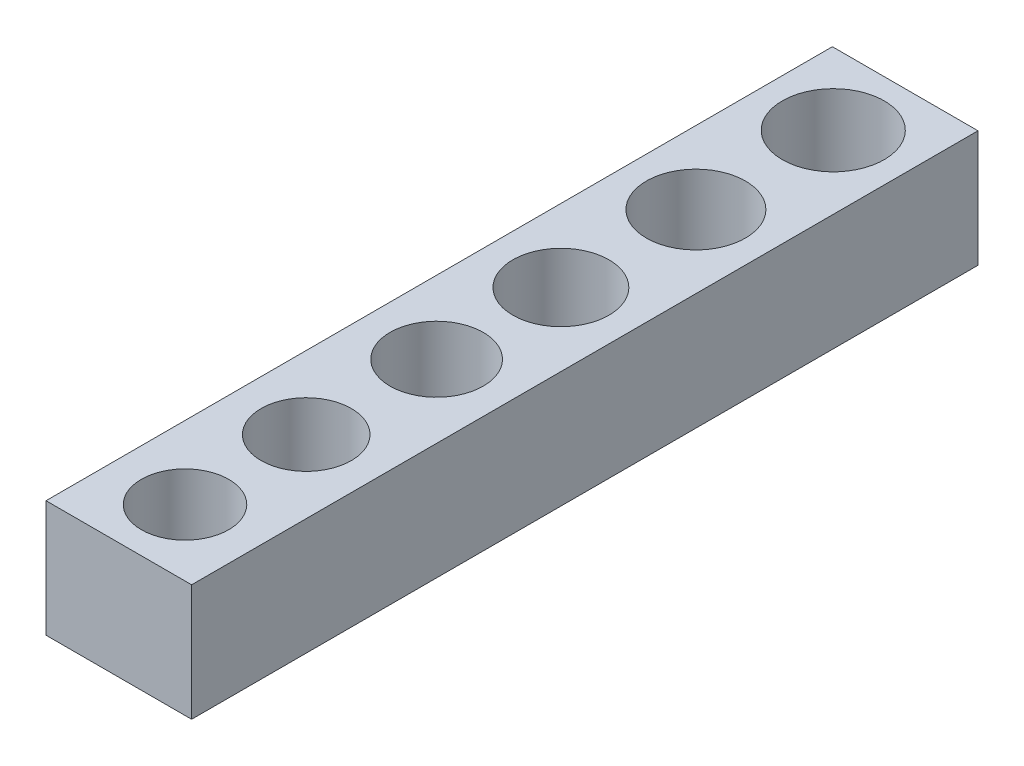
ISO-10303-21;
HEADER;
FILE_DESCRIPTION(('STEP AP214'),'2;1');
FILE_NAME('part.step','',(''),(''),'','','');
FILE_SCHEMA(('AUTOMOTIVE_DESIGN { 1 0 10303 214 1 1 1 1 }'));
ENDSEC;
DATA;
#1=APPLICATION_CONTEXT('core data for automotive mechanical design processes');
#2=APPLICATION_PROTOCOL_DEFINITION('international standard','automotive_design',2000,#1);
#3=PRODUCT_CONTEXT('',#1,'mechanical');
#4=PRODUCT('Part','Part','',(#3));
#5=PRODUCT_RELATED_PRODUCT_CATEGORY('part','',(#4));
#6=PRODUCT_DEFINITION_FORMATION('','',#4);
#7=PRODUCT_DEFINITION_CONTEXT('part definition',#1,'design');
#8=PRODUCT_DEFINITION('design','',#6,#7);
#9=PRODUCT_DEFINITION_SHAPE('','',#8);
#10=(LENGTH_UNIT() NAMED_UNIT(*) SI_UNIT(.MILLI.,.METRE.));
#11=(NAMED_UNIT(*) PLANE_ANGLE_UNIT() SI_UNIT($,.RADIAN.));
#12=(NAMED_UNIT(*) SI_UNIT($,.STERADIAN.) SOLID_ANGLE_UNIT());
#13=UNCERTAINTY_MEASURE_WITH_UNIT(LENGTH_MEASURE(1.E-05),#10,'distance_accuracy_value','');
#14=(GEOMETRIC_REPRESENTATION_CONTEXT(3) GLOBAL_UNCERTAINTY_ASSIGNED_CONTEXT((#13)) GLOBAL_UNIT_ASSIGNED_CONTEXT((#10,
#11,#12)) REPRESENTATION_CONTEXT('',''));
#15=CARTESIAN_POINT('',(0.,0.,0.));
#16=DIRECTION('',(0.,0.,1.));
#17=DIRECTION('',(1.,0.,0.));
#18=AXIS2_PLACEMENT_3D('',#15,#16,#17);
#19=CARTESIAN_POINT('',(0.,8.,0.));
#20=DIRECTION('',(0.,1.,0.));
#21=DIRECTION('',(0.,0.,1.));
#22=AXIS2_PLACEMENT_3D('',#19,#20,#21);
#23=PLANE('',#22);
#24=CARTESIAN_POINT('',(0.,8.,-20.0613158785714));
#25=DIRECTION('',(0.,1.,0.));
#26=DIRECTION('',(0.,0.,1.));
#27=AXIS2_PLACEMENT_3D('',#24,#25,#26);
#28=CIRCLE('',#27,3.5);
#29=CARTESIAN_POINT('',(0.,8.,-16.5613158785714));
#30=VERTEX_POINT('',#29);
#31=EDGE_CURVE('E164',#30,#30,#28,.T.);
#32=ORIENTED_EDGE('',*,*,#31,.F.);
#33=EDGE_LOOP('',(#32));
#34=FACE_BOUND('',#33,.T.);
#35=CARTESIAN_POINT('',(0.,8.,-10.6303891055312));
#36=DIRECTION('',(0.,1.,0.));
#37=DIRECTION('',(0.,0.,1.));
#38=AXIS2_PLACEMENT_3D('',#35,#36,#37);
#39=CIRCLE('',#38,3.4);
#40=CARTESIAN_POINT('',(0.,8.,-7.23038910553121));
#41=VERTEX_POINT('',#40);
#42=EDGE_CURVE('E148',#41,#41,#39,.T.);
#43=ORIENTED_EDGE('',*,*,#42,.F.);
#44=EDGE_LOOP('',(#43));
#45=FACE_BOUND('',#44,.T.);
#46=CARTESIAN_POINT('',(0.,8.,16.1307415705942));
#47=DIRECTION('',(0.,1.,0.));
#48=DIRECTION('',(0.,0.,1.));
#49=AXIS2_PLACEMENT_3D('',#46,#47,#48);
#50=CIRCLE('',#49,3.1);
#51=CARTESIAN_POINT('',(0.,8.,19.2307415705942));
#52=VERTEX_POINT('',#51);
#53=EDGE_CURVE('E118',#52,#52,#50,.T.);
#54=ORIENTED_EDGE('',*,*,#53,.F.);
#55=EDGE_LOOP('',(#54));
#56=FACE_BOUND('',#55,.T.);
#57=DIRECTION('',(0.,0.,1.));
#58=VECTOR('',#57,1.);
#59=CARTESIAN_POINT('',(-5.,8.,29.));
#60=LINE('',#59,#58);
#61=CARTESIAN_POINT('',(-5.,8.,-25.));
#62=VERTEX_POINT('',#61);
#63=CARTESIAN_POINT('',(-5.,8.,29.));
#64=VERTEX_POINT('',#63);
#65=EDGE_CURVE('E98',#62,#64,#60,.T.);
#66=ORIENTED_EDGE('',*,*,#65,.T.);
#67=DIRECTION('',(1.,0.,0.));
#68=VECTOR('',#67,1.);
#69=CARTESIAN_POINT('',(5.,8.,29.));
#70=LINE('',#69,#68);
#71=CARTESIAN_POINT('',(5.,8.,29.));
#72=VERTEX_POINT('',#71);
#73=EDGE_CURVE('E93',#64,#72,#70,.T.);
#74=ORIENTED_EDGE('',*,*,#73,.T.);
#75=DIRECTION('',(0.,0.,-1.));
#76=VECTOR('',#75,1.);
#77=CARTESIAN_POINT('',(5.,8.,29.));
#78=LINE('',#77,#76);
#79=CARTESIAN_POINT('',(5.,8.,-25.));
#80=VERTEX_POINT('',#79);
#81=EDGE_CURVE('E96',#72,#80,#78,.T.);
#82=ORIENTED_EDGE('',*,*,#81,.T.);
#83=DIRECTION('',(-1.,0.,0.));
#84=VECTOR('',#83,1.);
#85=CARTESIAN_POINT('',(5.,8.,-25.));
#86=LINE('',#85,#84);
#87=EDGE_CURVE('E63',#80,#62,#86,.T.);
#88=ORIENTED_EDGE('',*,*,#87,.T.);
#89=EDGE_LOOP('',(#66,#74,#82,#88));
#90=FACE_BOUND('',#89,.T.);
#91=CARTESIAN_POINT('',(0.,8.,-1.35881627285784));
#92=DIRECTION('',(0.,1.,0.));
#93=DIRECTION('',(0.,0.,1.));
#94=AXIS2_PLACEMENT_3D('',#91,#92,#93);
#95=CIRCLE('',#94,3.3);
#96=CARTESIAN_POINT('',(0.,8.,1.94118372714216));
#97=VERTEX_POINT('',#96);
#98=EDGE_CURVE('E140',#97,#97,#95,.T.);
#99=ORIENTED_EDGE('',*,*,#98,.F.);
#100=EDGE_LOOP('',(#99));
#101=FACE_BOUND('',#100,.T.);
#102=CARTESIAN_POINT('',(0.,8.,24.4540853635623));
#103=DIRECTION('',(0.,1.,0.));
#104=DIRECTION('',(0.,0.,1.));
#105=AXIS2_PLACEMENT_3D('',#102,#103,#104);
#106=CIRCLE('',#105,3.);
#107=CARTESIAN_POINT('',(0.,8.,27.4540853635623));
#108=VERTEX_POINT('',#107);
#109=EDGE_CURVE('E156',#108,#108,#106,.T.);
#110=ORIENTED_EDGE('',*,*,#109,.F.);
#111=EDGE_LOOP('',(#110));
#112=FACE_BOUND('',#111,.T.);
#113=CARTESIAN_POINT('',(0.,8.,7.17524508448924));
#114=DIRECTION('',(0.,1.,0.));
#115=DIRECTION('',(0.,0.,1.));
#116=AXIS2_PLACEMENT_3D('',#113,#114,#115);
#117=CIRCLE('',#116,3.2);
#118=CARTESIAN_POINT('',(0.,8.,10.3752450844892));
#119=VERTEX_POINT('',#118);
#120=EDGE_CURVE('E172',#119,#119,#117,.T.);
#121=ORIENTED_EDGE('',*,*,#120,.F.);
#122=EDGE_LOOP('',(#121));
#123=FACE_BOUND('',#122,.T.);
#124=ADVANCED_FACE('F45',(#34,#45,#56,#90,#101,#112,#123),#23,.T.);
#125=CARTESIAN_POINT('',(0.,0.,0.));
#126=DIRECTION('',(0.,1.,0.));
#127=DIRECTION('',(0.,0.,1.));
#128=AXIS2_PLACEMENT_3D('',#125,#126,#127);
#129=PLANE('',#128);
#130=DIRECTION('',(0.,0.,1.));
#131=VECTOR('',#130,1.);
#132=CARTESIAN_POINT('',(-5.,0.,29.));
#133=LINE('',#132,#131);
#134=CARTESIAN_POINT('',(-5.,0.,-25.));
#135=VERTEX_POINT('',#134);
#136=CARTESIAN_POINT('',(-5.,0.,29.));
#137=VERTEX_POINT('',#136);
#138=EDGE_CURVE('E114',#135,#137,#133,.T.);
#139=ORIENTED_EDGE('',*,*,#138,.F.);
#140=DIRECTION('',(-1.,0.,0.));
#141=VECTOR('',#140,1.);
#142=CARTESIAN_POINT('',(5.,0.,-25.));
#143=LINE('',#142,#141);
#144=CARTESIAN_POINT('',(5.,0.,-25.));
#145=VERTEX_POINT('',#144);
#146=EDGE_CURVE('E86',#145,#135,#143,.T.);
#147=ORIENTED_EDGE('',*,*,#146,.F.);
#148=DIRECTION('',(0.,0.,-1.));
#149=VECTOR('',#148,1.);
#150=CARTESIAN_POINT('',(5.,0.,29.));
#151=LINE('',#150,#149);
#152=CARTESIAN_POINT('',(5.,0.,29.));
#153=VERTEX_POINT('',#152);
#154=EDGE_CURVE('E80',#153,#145,#151,.T.);
#155=ORIENTED_EDGE('',*,*,#154,.F.);
#156=DIRECTION('',(1.,0.,0.));
#157=VECTOR('',#156,1.);
#158=CARTESIAN_POINT('',(5.,0.,29.));
#159=LINE('',#158,#157);
#160=EDGE_CURVE('E103',#137,#153,#159,.T.);
#161=ORIENTED_EDGE('',*,*,#160,.F.);
#162=EDGE_LOOP('',(#139,#147,#155,#161));
#163=FACE_BOUND('',#162,.T.);
#164=CARTESIAN_POINT('',(0.,0.,16.1307415705942));
#165=DIRECTION('',(0.,1.,0.));
#166=DIRECTION('',(0.,0.,1.));
#167=AXIS2_PLACEMENT_3D('',#164,#165,#166);
#168=CIRCLE('',#167,3.1);
#169=CARTESIAN_POINT('',(0.,0.,19.2307415705942));
#170=VERTEX_POINT('',#169);
#171=EDGE_CURVE('E136',#170,#170,#168,.T.);
#172=ORIENTED_EDGE('',*,*,#171,.T.);
#173=EDGE_LOOP('',(#172));
#174=FACE_BOUND('',#173,.T.);
#175=CARTESIAN_POINT('',(0.,0.,-1.35881627285784));
#176=DIRECTION('',(0.,1.,0.));
#177=DIRECTION('',(0.,0.,1.));
#178=AXIS2_PLACEMENT_3D('',#175,#176,#177);
#179=CIRCLE('',#178,3.3);
#180=CARTESIAN_POINT('',(0.,0.,1.94118372714216));
#181=VERTEX_POINT('',#180);
#182=EDGE_CURVE('E144',#181,#181,#179,.T.);
#183=ORIENTED_EDGE('',*,*,#182,.T.);
#184=EDGE_LOOP('',(#183));
#185=FACE_BOUND('',#184,.T.);
#186=CARTESIAN_POINT('',(0.,0.,-10.6303891055312));
#187=DIRECTION('',(0.,1.,0.));
#188=DIRECTION('',(0.,0.,1.));
#189=AXIS2_PLACEMENT_3D('',#186,#187,#188);
#190=CIRCLE('',#189,3.4);
#191=CARTESIAN_POINT('',(0.,0.,-7.23038910553121));
#192=VERTEX_POINT('',#191);
#193=EDGE_CURVE('E152',#192,#192,#190,.T.);
#194=ORIENTED_EDGE('',*,*,#193,.T.);
#195=EDGE_LOOP('',(#194));
#196=FACE_BOUND('',#195,.T.);
#197=CARTESIAN_POINT('',(0.,0.,24.4540853635623));
#198=DIRECTION('',(0.,1.,0.));
#199=DIRECTION('',(0.,0.,1.));
#200=AXIS2_PLACEMENT_3D('',#197,#198,#199);
#201=CIRCLE('',#200,3.);
#202=CARTESIAN_POINT('',(0.,0.,27.4540853635623));
#203=VERTEX_POINT('',#202);
#204=EDGE_CURVE('E160',#203,#203,#201,.T.);
#205=ORIENTED_EDGE('',*,*,#204,.T.);
#206=EDGE_LOOP('',(#205));
#207=FACE_BOUND('',#206,.T.);
#208=CARTESIAN_POINT('',(0.,0.,-20.0613158785714));
#209=DIRECTION('',(0.,1.,0.));
#210=DIRECTION('',(0.,0.,1.));
#211=AXIS2_PLACEMENT_3D('',#208,#209,#210);
#212=CIRCLE('',#211,3.5);
#213=CARTESIAN_POINT('',(0.,0.,-16.5613158785714));
#214=VERTEX_POINT('',#213);
#215=EDGE_CURVE('E168',#214,#214,#212,.T.);
#216=ORIENTED_EDGE('',*,*,#215,.T.);
#217=EDGE_LOOP('',(#216));
#218=FACE_BOUND('',#217,.T.);
#219=CARTESIAN_POINT('',(0.,0.,7.17524508448924));
#220=DIRECTION('',(0.,1.,0.));
#221=DIRECTION('',(0.,0.,1.));
#222=AXIS2_PLACEMENT_3D('',#219,#220,#221);
#223=CIRCLE('',#222,3.2);
#224=CARTESIAN_POINT('',(0.,0.,10.3752450844892));
#225=VERTEX_POINT('',#224);
#226=EDGE_CURVE('E176',#225,#225,#223,.T.);
#227=ORIENTED_EDGE('',*,*,#226,.T.);
#228=EDGE_LOOP('',(#227));
#229=FACE_BOUND('',#228,.T.);
#230=ADVANCED_FACE('F131',(#163,#174,#185,#196,#207,#218,#229),#129,.F.);
#231=CARTESIAN_POINT('',(-5.,8.,29.));
#232=DIRECTION('',(1.,0.,0.));
#233=DIRECTION('',(0.,0.,-1.));
#234=AXIS2_PLACEMENT_3D('',#231,#232,#233);
#235=PLANE('',#234);
#236=ORIENTED_EDGE('',*,*,#138,.T.);
#237=DIRECTION('',(0.,-1.,0.));
#238=VECTOR('',#237,1.);
#239=CARTESIAN_POINT('',(-5.,8.,29.));
#240=LINE('',#239,#238);
#241=EDGE_CURVE('E11',#64,#137,#240,.T.);
#242=ORIENTED_EDGE('',*,*,#241,.F.);
#243=ORIENTED_EDGE('',*,*,#65,.F.);
#244=DIRECTION('',(0.,-1.,0.));
#245=VECTOR('',#244,1.);
#246=CARTESIAN_POINT('',(-5.,8.,-25.));
#247=LINE('',#246,#245);
#248=EDGE_CURVE('E110',#62,#135,#247,.T.);
#249=ORIENTED_EDGE('',*,*,#248,.T.);
#250=EDGE_LOOP('',(#236,#242,#243,#249));
#251=FACE_BOUND('',#250,.T.);
#252=ADVANCED_FACE('F47',(#251),#235,.F.);
#253=CARTESIAN_POINT('',(5.,8.,29.));
#254=DIRECTION('',(0.,0.,-1.));
#255=DIRECTION('',(-1.,0.,0.));
#256=AXIS2_PLACEMENT_3D('',#253,#254,#255);
#257=PLANE('',#256);
#258=ORIENTED_EDGE('',*,*,#160,.T.);
#259=DIRECTION('',(0.,-1.,0.));
#260=VECTOR('',#259,1.);
#261=CARTESIAN_POINT('',(5.,8.,29.));
#262=LINE('',#261,#260);
#263=EDGE_CURVE('E55',#72,#153,#262,.T.);
#264=ORIENTED_EDGE('',*,*,#263,.F.);
#265=ORIENTED_EDGE('',*,*,#73,.F.);
#266=ORIENTED_EDGE('',*,*,#241,.T.);
#267=EDGE_LOOP('',(#258,#264,#265,#266));
#268=FACE_BOUND('',#267,.T.);
#269=ADVANCED_FACE('F102',(#268),#257,.F.);
#270=CARTESIAN_POINT('',(5.,8.,29.));
#271=DIRECTION('',(-1.,0.,0.));
#272=DIRECTION('',(0.,0.,1.));
#273=AXIS2_PLACEMENT_3D('',#270,#271,#272);
#274=PLANE('',#273);
#275=ORIENTED_EDGE('',*,*,#154,.T.);
#276=DIRECTION('',(0.,-1.,0.));
#277=VECTOR('',#276,1.);
#278=CARTESIAN_POINT('',(5.,8.,-25.));
#279=LINE('',#278,#277);
#280=EDGE_CURVE('E105',#80,#145,#279,.T.);
#281=ORIENTED_EDGE('',*,*,#280,.F.);
#282=ORIENTED_EDGE('',*,*,#81,.F.);
#283=ORIENTED_EDGE('',*,*,#263,.T.);
#284=EDGE_LOOP('',(#275,#281,#282,#283));
#285=FACE_BOUND('',#284,.T.);
#286=ADVANCED_FACE('F106',(#285),#274,.F.);
#287=CARTESIAN_POINT('',(5.,8.,-25.));
#288=DIRECTION('',(0.,0.,1.));
#289=DIRECTION('',(1.,0.,0.));
#290=AXIS2_PLACEMENT_3D('',#287,#288,#289);
#291=PLANE('',#290);
#292=ORIENTED_EDGE('',*,*,#146,.T.);
#293=ORIENTED_EDGE('',*,*,#248,.F.);
#294=ORIENTED_EDGE('',*,*,#87,.F.);
#295=ORIENTED_EDGE('',*,*,#280,.T.);
#296=EDGE_LOOP('',(#292,#293,#294,#295));
#297=FACE_BOUND('',#296,.T.);
#298=ADVANCED_FACE('F128',(#297),#291,.F.);
#299=CARTESIAN_POINT('',(0.,8.,16.1307415705942));
#300=DIRECTION('',(0.,-1.,0.));
#301=DIRECTION('',(0.,0.,-1.));
#302=AXIS2_PLACEMENT_3D('',#299,#300,#301);
#303=CYLINDRICAL_SURFACE('',#302,3.1);
#304=ORIENTED_EDGE('',*,*,#53,.T.);
#305=EDGE_LOOP('',(#304));
#306=FACE_BOUND('',#305,.T.);
#307=ORIENTED_EDGE('',*,*,#171,.F.);
#308=EDGE_LOOP('',(#307));
#309=FACE_BOUND('',#308,.T.);
#310=ADVANCED_FACE('F197',(#306,#309),#303,.F.);
#311=CARTESIAN_POINT('',(0.,8.,-1.35881627285784));
#312=DIRECTION('',(0.,-1.,0.));
#313=DIRECTION('',(0.,0.,-1.));
#314=AXIS2_PLACEMENT_3D('',#311,#312,#313);
#315=CYLINDRICAL_SURFACE('',#314,3.3);
#316=ORIENTED_EDGE('',*,*,#98,.T.);
#317=EDGE_LOOP('',(#316));
#318=FACE_BOUND('',#317,.T.);
#319=ORIENTED_EDGE('',*,*,#182,.F.);
#320=EDGE_LOOP('',(#319));
#321=FACE_BOUND('',#320,.T.);
#322=ADVANCED_FACE('F242',(#318,#321),#315,.F.);
#323=CARTESIAN_POINT('',(0.,8.,-10.6303891055312));
#324=DIRECTION('',(0.,-1.,0.));
#325=DIRECTION('',(0.,0.,-1.));
#326=AXIS2_PLACEMENT_3D('',#323,#324,#325);
#327=CYLINDRICAL_SURFACE('',#326,3.4);
#328=ORIENTED_EDGE('',*,*,#42,.T.);
#329=EDGE_LOOP('',(#328));
#330=FACE_BOUND('',#329,.T.);
#331=ORIENTED_EDGE('',*,*,#193,.F.);
#332=EDGE_LOOP('',(#331));
#333=FACE_BOUND('',#332,.T.);
#334=ADVANCED_FACE('F250',(#330,#333),#327,.F.);
#335=CARTESIAN_POINT('',(0.,8.,24.4540853635623));
#336=DIRECTION('',(0.,-1.,0.));
#337=DIRECTION('',(0.,0.,-1.));
#338=AXIS2_PLACEMENT_3D('',#335,#336,#337);
#339=CYLINDRICAL_SURFACE('',#338,3.);
#340=ORIENTED_EDGE('',*,*,#109,.T.);
#341=EDGE_LOOP('',(#340));
#342=FACE_BOUND('',#341,.T.);
#343=ORIENTED_EDGE('',*,*,#204,.F.);
#344=EDGE_LOOP('',(#343));
#345=FACE_BOUND('',#344,.T.);
#346=ADVANCED_FACE('F258',(#342,#345),#339,.F.);
#347=CARTESIAN_POINT('',(0.,8.,-20.0613158785714));
#348=DIRECTION('',(0.,-1.,0.));
#349=DIRECTION('',(0.,0.,-1.));
#350=AXIS2_PLACEMENT_3D('',#347,#348,#349);
#351=CYLINDRICAL_SURFACE('',#350,3.5);
#352=ORIENTED_EDGE('',*,*,#31,.T.);
#353=EDGE_LOOP('',(#352));
#354=FACE_BOUND('',#353,.T.);
#355=ORIENTED_EDGE('',*,*,#215,.F.);
#356=EDGE_LOOP('',(#355));
#357=FACE_BOUND('',#356,.T.);
#358=ADVANCED_FACE('F267',(#354,#357),#351,.F.);
#359=CARTESIAN_POINT('',(0.,8.,7.17524508448924));
#360=DIRECTION('',(0.,-1.,0.));
#361=DIRECTION('',(0.,0.,-1.));
#362=AXIS2_PLACEMENT_3D('',#359,#360,#361);
#363=CYLINDRICAL_SURFACE('',#362,3.2);
#364=ORIENTED_EDGE('',*,*,#120,.T.);
#365=EDGE_LOOP('',(#364));
#366=FACE_BOUND('',#365,.T.);
#367=ORIENTED_EDGE('',*,*,#226,.F.);
#368=EDGE_LOOP('',(#367));
#369=FACE_BOUND('',#368,.T.);
#370=ADVANCED_FACE('F184',(#366,#369),#363,.F.);
#371=CLOSED_SHELL('',(#124,#230,#252,#269,#286,#298,#310,#322,#334,#346,#358,#370));
#372=MANIFOLD_SOLID_BREP('B2',#371);
#373=ADVANCED_BREP_SHAPE_REPRESENTATION('',(#18,#372),#14);
#374=SHAPE_DEFINITION_REPRESENTATION(#9,#373);
ENDSEC;
END-ISO-10303-21;
